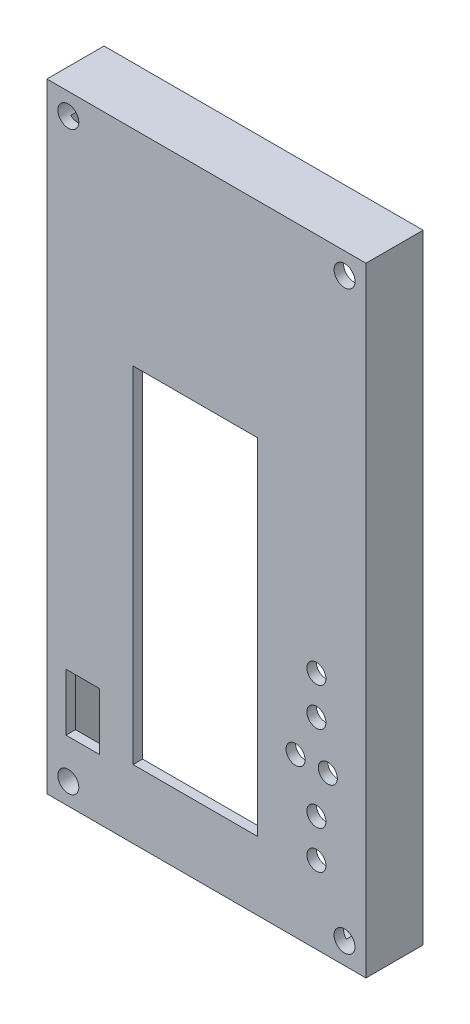
ISO-10303-21;
HEADER;
FILE_DESCRIPTION(('STEP AP214'),'2;1');
FILE_NAME('part.step','',(''),(''),'','','');
FILE_SCHEMA(('AUTOMOTIVE_DESIGN { 1 0 10303 214 1 1 1 1 }'));
ENDSEC;
DATA;
#1=APPLICATION_CONTEXT('core data for automotive mechanical design processes');
#2=APPLICATION_PROTOCOL_DEFINITION('international standard','automotive_design',2000,#1);
#3=PRODUCT_CONTEXT('',#1,'mechanical');
#4=PRODUCT('Part','Part','',(#3));
#5=PRODUCT_RELATED_PRODUCT_CATEGORY('part','',(#4));
#6=PRODUCT_DEFINITION_FORMATION('','',#4);
#7=PRODUCT_DEFINITION_CONTEXT('part definition',#1,'design');
#8=PRODUCT_DEFINITION('design','',#6,#7);
#9=PRODUCT_DEFINITION_SHAPE('','',#8);
#10=(LENGTH_UNIT() NAMED_UNIT(*) SI_UNIT(.MILLI.,.METRE.));
#11=(NAMED_UNIT(*) PLANE_ANGLE_UNIT() SI_UNIT($,.RADIAN.));
#12=(NAMED_UNIT(*) SI_UNIT($,.STERADIAN.) SOLID_ANGLE_UNIT());
#13=UNCERTAINTY_MEASURE_WITH_UNIT(LENGTH_MEASURE(1.E-05),#10,'distance_accuracy_value','');
#14=(GEOMETRIC_REPRESENTATION_CONTEXT(3) GLOBAL_UNCERTAINTY_ASSIGNED_CONTEXT((#13)) GLOBAL_UNIT_ASSIGNED_CONTEXT((#10,
#11,#12)) REPRESENTATION_CONTEXT('',''));
#15=CARTESIAN_POINT('',(0.,0.,0.));
#16=DIRECTION('',(0.,0.,1.));
#17=DIRECTION('',(1.,0.,0.));
#18=AXIS2_PLACEMENT_3D('',#15,#16,#17);
#19=CARTESIAN_POINT('',(0.,0.,0.));
#20=DIRECTION('',(0.,0.,-1.));
#21=DIRECTION('',(-1.,0.,0.));
#22=AXIS2_PLACEMENT_3D('',#19,#20,#21);
#23=PLANE('',#22);
#24=CARTESIAN_POINT('',(29.0000000000004,57.1675022635253,0.));
#25=DIRECTION('',(0.,0.,1.));
#26=DIRECTION('',(1.,0.,0.));
#27=AXIS2_PLACEMENT_3D('',#24,#25,#26);
#28=CIRCLE('',#27,2.2);
#29=CARTESIAN_POINT('',(30.5000000000004,55.5581545695822,0.));
#30=VERTEX_POINT('',#29);
#31=CARTESIAN_POINT('',(27.3906523060562,58.6675022635241,0.));
#32=VERTEX_POINT('',#31);
#33=EDGE_CURVE('E205',#30,#32,#28,.T.);
#34=ORIENTED_EDGE('',*,*,#33,.T.);
#35=DIRECTION('',(-1.,0.,0.));
#36=VECTOR('',#35,1.);
#37=CARTESIAN_POINT('',(-30.5000000000004,58.6675022635241,0.));
#38=LINE('',#37,#36);
#39=CARTESIAN_POINT('',(-27.390652306057,58.6675022635241,0.));
#40=VERTEX_POINT('',#39);
#41=EDGE_CURVE('E197',#32,#40,#38,.T.);
#42=ORIENTED_EDGE('',*,*,#41,.T.);
#43=CARTESIAN_POINT('',(-29.0000000000006,57.1675022635246,0.));
#44=DIRECTION('',(0.,0.,1.));
#45=DIRECTION('',(1.,0.,0.));
#46=AXIS2_PLACEMENT_3D('',#43,#44,#45);
#47=CIRCLE('',#46,2.2);
#48=CARTESIAN_POINT('',(-30.5000000000004,55.5581545695813,0.));
#49=VERTEX_POINT('',#48);
#50=EDGE_CURVE('E176',#40,#49,#47,.T.);
#51=ORIENTED_EDGE('',*,*,#50,.T.);
#52=DIRECTION('',(0.,-1.,0.));
#53=VECTOR('',#52,1.);
#54=CARTESIAN_POINT('',(-30.5000000000004,-65.3324977364759,0.));
#55=LINE('',#54,#53);
#56=CARTESIAN_POINT('',(-30.5000000000004,-62.2231500425326,0.));
#57=VERTEX_POINT('',#56);
#58=EDGE_CURVE('E277',#49,#57,#55,.T.);
#59=ORIENTED_EDGE('',*,*,#58,.T.);
#60=CARTESIAN_POINT('',(-29.0000000000006,-63.8324977364759,0.));
#61=DIRECTION('',(0.,0.,1.));
#62=DIRECTION('',(1.,0.,0.));
#63=AXIS2_PLACEMENT_3D('',#60,#61,#62);
#64=CIRCLE('',#63,2.2);
#65=CARTESIAN_POINT('',(-27.3906523060574,-65.3324977364759,0.));
#66=VERTEX_POINT('',#65);
#67=EDGE_CURVE('E296',#57,#66,#64,.T.);
#68=ORIENTED_EDGE('',*,*,#67,.T.);
#69=DIRECTION('',(1.,0.,0.));
#70=VECTOR('',#69,1.);
#71=CARTESIAN_POINT('',(-30.5000000000004,-65.3324977364759,0.));
#72=LINE('',#71,#70);
#73=CARTESIAN_POINT('',(27.3906523060573,-65.3324977364759,0.));
#74=VERTEX_POINT('',#73);
#75=EDGE_CURVE('E215',#66,#74,#72,.T.);
#76=ORIENTED_EDGE('',*,*,#75,.T.);
#77=CARTESIAN_POINT('',(29.0000000000004,-63.8324977364759,0.));
#78=DIRECTION('',(0.,0.,1.));
#79=DIRECTION('',(1.,0.,0.));
#80=AXIS2_PLACEMENT_3D('',#77,#78,#79);
#81=CIRCLE('',#80,2.2);
#82=CARTESIAN_POINT('',(30.5000000000004,-62.2231500425328,0.));
#83=VERTEX_POINT('',#82);
#84=EDGE_CURVE('E294',#74,#83,#81,.T.);
#85=ORIENTED_EDGE('',*,*,#84,.T.);
#86=DIRECTION('',(0.,1.,0.));
#87=VECTOR('',#86,1.);
#88=CARTESIAN_POINT('',(30.5000000000004,-65.3324977364759,0.));
#89=LINE('',#88,#87);
#90=EDGE_CURVE('E208',#83,#30,#89,.T.);
#91=ORIENTED_EDGE('',*,*,#90,.T.);
#92=EDGE_LOOP('',(#34,#42,#51,#59,#68,#76,#85,#91));
#93=FACE_BOUND('',#92,.T.);
#94=DIRECTION('',(0.,-1.,0.));
#95=VECTOR('',#94,1.);
#96=CARTESIAN_POINT('',(-33.5000000000004,-68.3324977364759,0.));
#97=LINE('',#96,#95);
#98=CARTESIAN_POINT('',(-33.5000000000004,61.6675022635241,0.));
#99=VERTEX_POINT('',#98);
#100=CARTESIAN_POINT('',(-33.5000000000004,-68.3324977364759,0.));
#101=VERTEX_POINT('',#100);
#102=EDGE_CURVE('E219',#99,#101,#97,.T.);
#103=ORIENTED_EDGE('',*,*,#102,.F.);
#104=DIRECTION('',(-1.,0.,0.));
#105=VECTOR('',#104,1.);
#106=CARTESIAN_POINT('',(-33.5000000000004,61.6675022635241,0.));
#107=LINE('',#106,#105);
#108=CARTESIAN_POINT('',(33.5000000000004,61.6675022635241,0.));
#109=VERTEX_POINT('',#108);
#110=EDGE_CURVE('E229',#109,#99,#107,.T.);
#111=ORIENTED_EDGE('',*,*,#110,.F.);
#112=DIRECTION('',(0.,1.,0.));
#113=VECTOR('',#112,1.);
#114=CARTESIAN_POINT('',(33.5000000000004,-68.3324977364759,0.));
#115=LINE('',#114,#113);
#116=CARTESIAN_POINT('',(33.5000000000004,-68.3324977364759,0.));
#117=VERTEX_POINT('',#116);
#118=EDGE_CURVE('E226',#117,#109,#115,.T.);
#119=ORIENTED_EDGE('',*,*,#118,.F.);
#120=DIRECTION('',(1.,0.,0.));
#121=VECTOR('',#120,1.);
#122=CARTESIAN_POINT('',(-33.5000000000004,-68.3324977364759,0.));
#123=LINE('',#122,#121);
#124=EDGE_CURVE('E223',#101,#117,#123,.T.);
#125=ORIENTED_EDGE('',*,*,#124,.F.);
#126=EDGE_LOOP('',(#103,#111,#119,#125));
#127=FACE_BOUND('',#126,.T.);
#128=ADVANCED_FACE('F39',(#93,#127),#23,.T.);
#129=CARTESIAN_POINT('',(-33.5000000000004,-68.3324977364759,10.));
#130=DIRECTION('',(1.,0.,0.));
#131=DIRECTION('',(0.,0.,-1.));
#132=AXIS2_PLACEMENT_3D('',#129,#130,#131);
#133=PLANE('',#132);
#134=ORIENTED_EDGE('',*,*,#102,.T.);
#135=DIRECTION('',(0.,0.,-1.));
#136=VECTOR('',#135,1.);
#137=CARTESIAN_POINT('',(-33.5000000000004,-68.3324977364759,10.));
#138=LINE('',#137,#136);
#139=CARTESIAN_POINT('',(-33.5000000000004,-68.3324977364759,12.));
#140=VERTEX_POINT('',#139);
#141=EDGE_CURVE('E11',#140,#101,#138,.T.);
#142=ORIENTED_EDGE('',*,*,#141,.F.);
#143=DIRECTION('',(0.,-1.,0.));
#144=VECTOR('',#143,1.);
#145=CARTESIAN_POINT('',(-33.5000000000004,-68.3324977364759,12.));
#146=LINE('',#145,#144);
#147=CARTESIAN_POINT('',(-33.5000000000004,61.6675022635241,12.));
#148=VERTEX_POINT('',#147);
#149=EDGE_CURVE('E259',#148,#140,#146,.T.);
#150=ORIENTED_EDGE('',*,*,#149,.F.);
#151=DIRECTION('',(0.,0.,-1.));
#152=VECTOR('',#151,1.);
#153=CARTESIAN_POINT('',(-33.5000000000004,61.6675022635241,10.));
#154=LINE('',#153,#152);
#155=EDGE_CURVE('E232',#148,#99,#154,.T.);
#156=ORIENTED_EDGE('',*,*,#155,.T.);
#157=EDGE_LOOP('',(#134,#142,#150,#156));
#158=FACE_BOUND('',#157,.T.);
#159=ADVANCED_FACE('F41',(#158),#133,.F.);
#160=CARTESIAN_POINT('',(-33.5000000000004,-68.3324977364759,10.));
#161=DIRECTION('',(0.,1.,0.));
#162=DIRECTION('',(0.,0.,1.));
#163=AXIS2_PLACEMENT_3D('',#160,#161,#162);
#164=PLANE('',#163);
#165=ORIENTED_EDGE('',*,*,#124,.T.);
#166=DIRECTION('',(0.,0.,-1.));
#167=VECTOR('',#166,1.);
#168=CARTESIAN_POINT('',(33.5000000000004,-68.3324977364759,10.));
#169=LINE('',#168,#167);
#170=CARTESIAN_POINT('',(33.5000000000004,-68.3324977364759,12.));
#171=VERTEX_POINT('',#170);
#172=EDGE_CURVE('E48',#171,#117,#169,.T.);
#173=ORIENTED_EDGE('',*,*,#172,.F.);
#174=DIRECTION('',(1.,0.,0.));
#175=VECTOR('',#174,1.);
#176=CARTESIAN_POINT('',(-33.5000000000004,-68.3324977364759,12.));
#177=LINE('',#176,#175);
#178=EDGE_CURVE('E262',#140,#171,#177,.T.);
#179=ORIENTED_EDGE('',*,*,#178,.F.);
#180=ORIENTED_EDGE('',*,*,#141,.T.);
#181=EDGE_LOOP('',(#165,#173,#179,#180));
#182=FACE_BOUND('',#181,.T.);
#183=ADVANCED_FACE('F510',(#182),#164,.F.);
#184=CARTESIAN_POINT('',(33.5000000000004,-68.3324977364759,10.));
#185=DIRECTION('',(-1.,0.,0.));
#186=DIRECTION('',(0.,0.,1.));
#187=AXIS2_PLACEMENT_3D('',#184,#185,#186);
#188=PLANE('',#187);
#189=ORIENTED_EDGE('',*,*,#118,.T.);
#190=DIRECTION('',(0.,0.,-1.));
#191=VECTOR('',#190,1.);
#192=CARTESIAN_POINT('',(33.5000000000004,61.6675022635241,10.));
#193=LINE('',#192,#191);
#194=CARTESIAN_POINT('',(33.5000000000004,61.6675022635241,12.));
#195=VERTEX_POINT('',#194);
#196=EDGE_CURVE('E236',#195,#109,#193,.T.);
#197=ORIENTED_EDGE('',*,*,#196,.F.);
#198=DIRECTION('',(0.,1.,0.));
#199=VECTOR('',#198,1.);
#200=CARTESIAN_POINT('',(33.5000000000004,-68.3324977364759,12.));
#201=LINE('',#200,#199);
#202=EDGE_CURVE('E246',#171,#195,#201,.T.);
#203=ORIENTED_EDGE('',*,*,#202,.F.);
#204=ORIENTED_EDGE('',*,*,#172,.T.);
#205=EDGE_LOOP('',(#189,#197,#203,#204));
#206=FACE_BOUND('',#205,.T.);
#207=ADVANCED_FACE('F244',(#206),#188,.F.);
#208=CARTESIAN_POINT('',(-33.5000000000004,61.6675022635241,10.));
#209=DIRECTION('',(0.,-1.,0.));
#210=DIRECTION('',(0.,0.,-1.));
#211=AXIS2_PLACEMENT_3D('',#208,#209,#210);
#212=PLANE('',#211);
#213=ORIENTED_EDGE('',*,*,#110,.T.);
#214=ORIENTED_EDGE('',*,*,#155,.F.);
#215=DIRECTION('',(-1.,0.,0.));
#216=VECTOR('',#215,1.);
#217=CARTESIAN_POINT('',(-33.5000000000004,61.6675022635241,12.));
#218=LINE('',#217,#216);
#219=EDGE_CURVE('E275',#195,#148,#218,.T.);
#220=ORIENTED_EDGE('',*,*,#219,.F.);
#221=ORIENTED_EDGE('',*,*,#196,.T.);
#222=EDGE_LOOP('',(#213,#214,#220,#221));
#223=FACE_BOUND('',#222,.T.);
#224=ADVANCED_FACE('F253',(#223),#212,.F.);
#225=CARTESIAN_POINT('',(-30.5000000000004,-65.3324977364759,10.));
#226=DIRECTION('',(1.,0.,0.));
#227=DIRECTION('',(0.,0.,-1.));
#228=AXIS2_PLACEMENT_3D('',#225,#226,#227);
#229=PLANE('',#228);
#230=DIRECTION('',(0.,0.,1.));
#231=VECTOR('',#230,1.);
#232=CARTESIAN_POINT('',(-30.5000000000004,-62.2231500425326,0.));
#233=LINE('',#232,#231);
#234=CARTESIAN_POINT('',(-30.5000000000004,-62.2231500425326,10.));
#235=VERTEX_POINT('',#234);
#236=EDGE_CURVE('E315',#57,#235,#233,.T.);
#237=ORIENTED_EDGE('',*,*,#236,.F.);
#238=ORIENTED_EDGE('',*,*,#58,.F.);
#239=DIRECTION('',(0.,0.,1.));
#240=VECTOR('',#239,1.);
#241=CARTESIAN_POINT('',(-30.5000000000004,55.5581545695813,0.));
#242=LINE('',#241,#240);
#243=CARTESIAN_POINT('',(-30.5000000000004,55.5581545695813,10.));
#244=VERTEX_POINT('',#243);
#245=EDGE_CURVE('E183',#244,#49,#242,.F.);
#246=ORIENTED_EDGE('',*,*,#245,.F.);
#247=DIRECTION('',(0.,-1.,0.));
#248=VECTOR('',#247,1.);
#249=CARTESIAN_POINT('',(-30.5000000000004,-65.3324977364759,10.));
#250=LINE('',#249,#248);
#251=EDGE_CURVE('E207',#244,#235,#250,.T.);
#252=ORIENTED_EDGE('',*,*,#251,.T.);
#253=EDGE_LOOP('',(#237,#238,#246,#252));
#254=FACE_BOUND('',#253,.T.);
#255=ADVANCED_FACE('F513',(#254),#229,.T.);
#256=CARTESIAN_POINT('',(-30.5000000000004,-65.3324977364759,10.));
#257=DIRECTION('',(0.,1.,0.));
#258=DIRECTION('',(0.,0.,1.));
#259=AXIS2_PLACEMENT_3D('',#256,#257,#258);
#260=PLANE('',#259);
#261=DIRECTION('',(0.,0.,1.));
#262=VECTOR('',#261,1.);
#263=CARTESIAN_POINT('',(-27.3906523060574,-65.3324977364759,0.));
#264=LINE('',#263,#262);
#265=CARTESIAN_POINT('',(-27.3906523060574,-65.3324977364759,10.));
#266=VERTEX_POINT('',#265);
#267=EDGE_CURVE('E300',#266,#66,#264,.F.);
#268=ORIENTED_EDGE('',*,*,#267,.F.);
#269=DIRECTION('',(1.,0.,0.));
#270=VECTOR('',#269,1.);
#271=CARTESIAN_POINT('',(-30.5000000000004,-65.3324977364759,10.));
#272=LINE('',#271,#270);
#273=CARTESIAN_POINT('',(27.3906523060573,-65.3324977364759,10.));
#274=VERTEX_POINT('',#273);
#275=EDGE_CURVE('E213',#266,#274,#272,.T.);
#276=ORIENTED_EDGE('',*,*,#275,.T.);
#277=DIRECTION('',(0.,0.,1.));
#278=VECTOR('',#277,1.);
#279=CARTESIAN_POINT('',(27.3906523060573,-65.3324977364759,0.));
#280=LINE('',#279,#278);
#281=EDGE_CURVE('E55',#74,#274,#280,.T.);
#282=ORIENTED_EDGE('',*,*,#281,.F.);
#283=ORIENTED_EDGE('',*,*,#75,.F.);
#284=EDGE_LOOP('',(#268,#276,#282,#283));
#285=FACE_BOUND('',#284,.T.);
#286=ADVANCED_FACE('F299',(#285),#260,.T.);
#287=CARTESIAN_POINT('',(30.5000000000004,-65.3324977364759,10.));
#288=DIRECTION('',(-1.,0.,0.));
#289=DIRECTION('',(0.,-1.,0.));
#290=AXIS2_PLACEMENT_3D('',#287,#288,#289);
#291=PLANE('',#290);
#292=DIRECTION('',(0.,0.,1.));
#293=VECTOR('',#292,1.);
#294=CARTESIAN_POINT('',(30.5000000000004,55.5581545695822,0.));
#295=LINE('',#294,#293);
#296=CARTESIAN_POINT('',(30.5000000000004,55.5581545695822,10.));
#297=VERTEX_POINT('',#296);
#298=EDGE_CURVE('E63',#30,#297,#295,.T.);
#299=ORIENTED_EDGE('',*,*,#298,.F.);
#300=ORIENTED_EDGE('',*,*,#90,.F.);
#301=DIRECTION('',(0.,0.,1.));
#302=VECTOR('',#301,1.);
#303=CARTESIAN_POINT('',(30.5000000000004,-62.2231500425328,0.));
#304=LINE('',#303,#302);
#305=CARTESIAN_POINT('',(30.5000000000004,-62.2231500425328,10.));
#306=VERTEX_POINT('',#305);
#307=EDGE_CURVE('E304',#306,#83,#304,.F.);
#308=ORIENTED_EDGE('',*,*,#307,.F.);
#309=DIRECTION('',(0.,1.,0.));
#310=VECTOR('',#309,1.);
#311=CARTESIAN_POINT('',(30.5000000000004,-65.3324977364759,10.));
#312=LINE('',#311,#310);
#313=EDGE_CURVE('E282',#306,#297,#312,.T.);
#314=ORIENTED_EDGE('',*,*,#313,.T.);
#315=EDGE_LOOP('',(#299,#300,#308,#314));
#316=FACE_BOUND('',#315,.T.);
#317=ADVANCED_FACE('F544',(#316),#291,.T.);
#318=CARTESIAN_POINT('',(-30.5000000000004,58.6675022635241,10.));
#319=DIRECTION('',(0.,-1.,0.));
#320=DIRECTION('',(0.,0.,-1.));
#321=AXIS2_PLACEMENT_3D('',#318,#319,#320);
#322=PLANE('',#321);
#323=DIRECTION('',(0.,0.,1.));
#324=VECTOR('',#323,1.);
#325=CARTESIAN_POINT('',(27.3906523060562,58.6675022635241,0.));
#326=LINE('',#325,#324);
#327=CARTESIAN_POINT('',(27.3906523060562,58.6675022635241,10.));
#328=VERTEX_POINT('',#327);
#329=EDGE_CURVE('E321',#328,#32,#326,.F.);
#330=ORIENTED_EDGE('',*,*,#329,.F.);
#331=DIRECTION('',(-1.,0.,0.));
#332=VECTOR('',#331,1.);
#333=CARTESIAN_POINT('',(-30.5000000000004,58.6675022635241,10.));
#334=LINE('',#333,#332);
#335=CARTESIAN_POINT('',(-27.390652306057,58.6675022635241,10.));
#336=VERTEX_POINT('',#335);
#337=EDGE_CURVE('E199',#328,#336,#334,.T.);
#338=ORIENTED_EDGE('',*,*,#337,.T.);
#339=DIRECTION('',(0.,0.,1.));
#340=VECTOR('',#339,1.);
#341=CARTESIAN_POINT('',(-27.390652306057,58.6675022635241,0.));
#342=LINE('',#341,#340);
#343=EDGE_CURVE('E180',#40,#336,#342,.T.);
#344=ORIENTED_EDGE('',*,*,#343,.F.);
#345=ORIENTED_EDGE('',*,*,#41,.F.);
#346=EDGE_LOOP('',(#330,#338,#344,#345));
#347=FACE_BOUND('',#346,.T.);
#348=ADVANCED_FACE('F196',(#347),#322,.T.);
#349=CARTESIAN_POINT('',(0.,0.,10.));
#350=DIRECTION('',(0.,0.,-1.));
#351=DIRECTION('',(-1.,0.,0.));
#352=AXIS2_PLACEMENT_3D('',#349,#350,#351);
#353=PLANE('',#352);
#354=CARTESIAN_POINT('',(29.0000000000004,57.1675022635253,10.));
#355=DIRECTION('',(0.,0.,-1.));
#356=DIRECTION('',(-1.,0.,0.));
#357=AXIS2_PLACEMENT_3D('',#354,#355,#356);
#358=CIRCLE('',#357,2.2);
#359=EDGE_CURVE('E318',#297,#328,#358,.T.);
#360=ORIENTED_EDGE('',*,*,#359,.F.);
#361=ORIENTED_EDGE('',*,*,#313,.F.);
#362=CARTESIAN_POINT('',(29.0000000000004,-63.8324977364759,10.));
#363=DIRECTION('',(0.,0.,-1.));
#364=DIRECTION('',(-1.,0.,0.));
#365=AXIS2_PLACEMENT_3D('',#362,#363,#364);
#366=CIRCLE('',#365,2.2);
#367=EDGE_CURVE('E309',#274,#306,#366,.T.);
#368=ORIENTED_EDGE('',*,*,#367,.F.);
#369=ORIENTED_EDGE('',*,*,#275,.F.);
#370=CARTESIAN_POINT('',(-29.0000000000006,-63.8324977364759,10.));
#371=DIRECTION('',(0.,0.,-1.));
#372=DIRECTION('',(-1.,0.,0.));
#373=AXIS2_PLACEMENT_3D('',#370,#371,#372);
#374=CIRCLE('',#373,2.2);
#375=EDGE_CURVE('E303',#235,#266,#374,.T.);
#376=ORIENTED_EDGE('',*,*,#375,.F.);
#377=ORIENTED_EDGE('',*,*,#251,.F.);
#378=CARTESIAN_POINT('',(-29.0000000000006,57.1675022635246,10.));
#379=DIRECTION('',(0.,0.,-1.));
#380=DIRECTION('',(-1.,0.,0.));
#381=AXIS2_PLACEMENT_3D('',#378,#379,#380);
#382=CIRCLE('',#381,2.2);
#383=EDGE_CURVE('E189',#336,#244,#382,.T.);
#384=ORIENTED_EDGE('',*,*,#383,.F.);
#385=ORIENTED_EDGE('',*,*,#337,.F.);
#386=EDGE_LOOP('',(#360,#361,#368,#369,#376,#377,#384,#385));
#387=FACE_BOUND('',#386,.T.);
#388=CARTESIAN_POINT('',(23.0964500000001,-52.1195522635235,10.));
#389=DIRECTION('',(0.,0.,-1.));
#390=DIRECTION('',(-1.,0.,0.));
#391=AXIS2_PLACEMENT_3D('',#388,#389,#390);
#392=CIRCLE('',#391,2.);
#393=CARTESIAN_POINT('',(21.0964500000001,-52.1195522635235,10.));
#394=VERTEX_POINT('',#393);
#395=EDGE_CURVE('E370',#394,#394,#392,.T.);
#396=ORIENTED_EDGE('',*,*,#395,.F.);
#397=EDGE_LOOP('',(#396));
#398=FACE_BOUND('',#397,.T.);
#399=CARTESIAN_POINT('',(23.0964499999998,-26.1154522635235,10.));
#400=DIRECTION('',(0.,0.,-1.));
#401=DIRECTION('',(-1.,0.,0.));
#402=AXIS2_PLACEMENT_3D('',#399,#400,#401);
#403=CIRCLE('',#402,2.);
#404=CARTESIAN_POINT('',(21.0964499999998,-26.1154522635235,10.));
#405=VERTEX_POINT('',#404);
#406=EDGE_CURVE('E366',#405,#405,#403,.T.);
#407=ORIENTED_EDGE('',*,*,#406,.F.);
#408=EDGE_LOOP('',(#407));
#409=FACE_BOUND('',#408,.T.);
#410=CARTESIAN_POINT('',(18.7156472457008,-35.0638056060374,10.));
#411=DIRECTION('',(0.,0.,-1.));
#412=DIRECTION('',(-1.,0.,0.));
#413=AXIS2_PLACEMENT_3D('',#410,#411,#412);
#414=CIRCLE('',#413,2.);
#415=CARTESIAN_POINT('',(16.7156472457008,-35.0638056060374,10.));
#416=VERTEX_POINT('',#415);
#417=EDGE_CURVE('E362',#416,#416,#414,.T.);
#418=ORIENTED_EDGE('',*,*,#417,.F.);
#419=EDGE_LOOP('',(#418));
#420=FACE_BOUND('',#419,.T.);
#421=CARTESIAN_POINT('',(25.4964635542668,-35.0661063612734,10.));
#422=DIRECTION('',(0.,0.,-1.));
#423=DIRECTION('',(-1.,0.,0.));
#424=AXIS2_PLACEMENT_3D('',#421,#422,#423);
#425=CIRCLE('',#424,2.);
#426=CARTESIAN_POINT('',(23.4964635542668,-35.0661063612734,10.));
#427=VERTEX_POINT('',#426);
#428=EDGE_CURVE('E358',#427,#427,#425,.T.);
#429=ORIENTED_EDGE('',*,*,#428,.F.);
#430=EDGE_LOOP('',(#429));
#431=FACE_BOUND('',#430,.T.);
#432=CARTESIAN_POINT('',(23.09645,-44.1154522635235,10.));
#433=DIRECTION('',(0.,0.,-1.));
#434=DIRECTION('',(-1.,0.,0.));
#435=AXIS2_PLACEMENT_3D('',#432,#433,#434);
#436=CIRCLE('',#435,2.);
#437=CARTESIAN_POINT('',(21.09645,-44.1154522635235,10.));
#438=VERTEX_POINT('',#437);
#439=EDGE_CURVE('E354',#438,#438,#436,.T.);
#440=ORIENTED_EDGE('',*,*,#439,.F.);
#441=EDGE_LOOP('',(#440));
#442=FACE_BOUND('',#441,.T.);
#443=CARTESIAN_POINT('',(23.0964499999997,-18.1154522635235,10.));
#444=DIRECTION('',(0.,0.,-1.));
#445=DIRECTION('',(-1.,0.,0.));
#446=AXIS2_PLACEMENT_3D('',#443,#444,#445);
#447=CIRCLE('',#446,2.);
#448=CARTESIAN_POINT('',(21.0964499999997,-18.1154522635235,10.));
#449=VERTEX_POINT('',#448);
#450=EDGE_CURVE('E331',#449,#449,#447,.T.);
#451=ORIENTED_EDGE('',*,*,#450,.F.);
#452=EDGE_LOOP('',(#451));
#453=FACE_BOUND('',#452,.T.);
#454=DIRECTION('',(-1.,0.,0.));
#455=VECTOR('',#454,1.);
#456=CARTESIAN_POINT('',(-29.5000000000004,-43.6675022664759,10.));
#457=LINE('',#456,#455);
#458=CARTESIAN_POINT('',(-22.5000000000004,-43.6675022664759,10.));
#459=VERTEX_POINT('',#458);
#460=CARTESIAN_POINT('',(-29.5000000000004,-43.6675022664759,10.));
#461=VERTEX_POINT('',#460);
#462=EDGE_CURVE('E379',#459,#461,#457,.T.);
#463=ORIENTED_EDGE('',*,*,#462,.T.);
#464=DIRECTION('',(0.,-1.,0.));
#465=VECTOR('',#464,1.);
#466=CARTESIAN_POINT('',(-29.5000000000004,-55.6675022635241,10.));
#467=LINE('',#466,#465);
#468=CARTESIAN_POINT('',(-29.5000000000004,-55.6675022635241,10.));
#469=VERTEX_POINT('',#468);
#470=EDGE_CURVE('E374',#461,#469,#467,.T.);
#471=ORIENTED_EDGE('',*,*,#470,.T.);
#472=DIRECTION('',(1.,0.,0.));
#473=VECTOR('',#472,1.);
#474=CARTESIAN_POINT('',(-29.5000000000004,-55.6675022635241,10.));
#475=LINE('',#474,#473);
#476=CARTESIAN_POINT('',(-22.5000000000004,-55.6675022635241,10.));
#477=VERTEX_POINT('',#476);
#478=EDGE_CURVE('E393',#469,#477,#475,.T.);
#479=ORIENTED_EDGE('',*,*,#478,.T.);
#480=DIRECTION('',(0.,1.,0.));
#481=VECTOR('',#480,1.);
#482=CARTESIAN_POINT('',(-22.5000000000004,-55.6675022635241,10.));
#483=LINE('',#482,#481);
#484=EDGE_CURVE('E397',#477,#459,#483,.T.);
#485=ORIENTED_EDGE('',*,*,#484,.T.);
#486=EDGE_LOOP('',(#463,#471,#479,#485));
#487=FACE_BOUND('',#486,.T.);
#488=DIRECTION('',(-1.,0.,0.));
#489=VECTOR('',#488,1.);
#490=CARTESIAN_POINT('',(-15.4000000000004,18.5324977364759,10.));
#491=LINE('',#490,#489);
#492=CARTESIAN_POINT('',(10.6999999999996,18.5324977364759,10.));
#493=VERTEX_POINT('',#492);
#494=CARTESIAN_POINT('',(-15.4000000000004,18.5324977364759,10.));
#495=VERTEX_POINT('',#494);
#496=EDGE_CURVE('E422',#493,#495,#491,.T.);
#497=ORIENTED_EDGE('',*,*,#496,.T.);
#498=DIRECTION('',(0.,-1.,0.));
#499=VECTOR('',#498,1.);
#500=CARTESIAN_POINT('',(-15.4000000000004,-53.9675022635241,10.));
#501=LINE('',#500,#499);
#502=CARTESIAN_POINT('',(-15.4000000000004,-53.9675022635241,10.));
#503=VERTEX_POINT('',#502);
#504=EDGE_CURVE('E417',#495,#503,#501,.T.);
#505=ORIENTED_EDGE('',*,*,#504,.T.);
#506=DIRECTION('',(1.,0.,0.));
#507=VECTOR('',#506,1.);
#508=CARTESIAN_POINT('',(-15.4000000000004,-53.9675022635241,10.));
#509=LINE('',#508,#507);
#510=CARTESIAN_POINT('',(10.6999999999996,-53.9675022635241,10.));
#511=VERTEX_POINT('',#510);
#512=EDGE_CURVE('E436',#503,#511,#509,.T.);
#513=ORIENTED_EDGE('',*,*,#512,.T.);
#514=DIRECTION('',(0.,1.,0.));
#515=VECTOR('',#514,1.);
#516=CARTESIAN_POINT('',(10.6999999999996,-53.9675022635241,10.));
#517=LINE('',#516,#515);
#518=EDGE_CURVE('E440',#511,#493,#517,.T.);
#519=ORIENTED_EDGE('',*,*,#518,.T.);
#520=EDGE_LOOP('',(#497,#505,#513,#519));
#521=FACE_BOUND('',#520,.T.);
#522=ADVANCED_FACE('F464',(#387,#398,#409,#420,#431,#442,#453,#487,#521),#353,.T.);
#523=CARTESIAN_POINT('',(0.,0.,12.));
#524=DIRECTION('',(0.,0.,-1.));
#525=DIRECTION('',(-1.,0.,0.));
#526=AXIS2_PLACEMENT_3D('',#523,#524,#525);
#527=PLANE('',#526);
#528=CARTESIAN_POINT('',(29.0000000000004,57.1675022635253,12.));
#529=DIRECTION('',(0.,0.,1.));
#530=DIRECTION('',(1.,0.,0.));
#531=AXIS2_PLACEMENT_3D('',#528,#529,#530);
#532=CIRCLE('',#531,2.2);
#533=CARTESIAN_POINT('',(31.2000000000004,57.1675022635253,12.));
#534=VERTEX_POINT('',#533);
#535=EDGE_CURVE('E761',#534,#534,#532,.T.);
#536=ORIENTED_EDGE('',*,*,#535,.F.);
#537=EDGE_LOOP('',(#536));
#538=FACE_BOUND('',#537,.T.);
#539=CARTESIAN_POINT('',(-29.0000000000006,-63.8324977364759,12.));
#540=DIRECTION('',(0.,0.,1.));
#541=DIRECTION('',(1.,0.,0.));
#542=AXIS2_PLACEMENT_3D('',#539,#540,#541);
#543=CIRCLE('',#542,2.2);
#544=CARTESIAN_POINT('',(-26.8000000000005,-63.8324977364759,12.));
#545=VERTEX_POINT('',#544);
#546=EDGE_CURVE('E767',#545,#545,#543,.T.);
#547=ORIENTED_EDGE('',*,*,#546,.F.);
#548=EDGE_LOOP('',(#547));
#549=FACE_BOUND('',#548,.T.);
#550=CARTESIAN_POINT('',(29.0000000000004,-63.8324977364759,12.));
#551=DIRECTION('',(0.,0.,1.));
#552=DIRECTION('',(1.,0.,0.));
#553=AXIS2_PLACEMENT_3D('',#550,#551,#552);
#554=CIRCLE('',#553,2.2);
#555=CARTESIAN_POINT('',(31.2000000000004,-63.8324977364759,12.));
#556=VERTEX_POINT('',#555);
#557=EDGE_CURVE('E795',#556,#556,#554,.T.);
#558=ORIENTED_EDGE('',*,*,#557,.F.);
#559=EDGE_LOOP('',(#558));
#560=FACE_BOUND('',#559,.T.);
#561=CARTESIAN_POINT('',(-29.0000000000006,57.1675022635246,12.));
#562=DIRECTION('',(0.,0.,1.));
#563=DIRECTION('',(1.,0.,0.));
#564=AXIS2_PLACEMENT_3D('',#561,#562,#563);
#565=CIRCLE('',#564,2.2);
#566=CARTESIAN_POINT('',(-26.8000000000005,57.1675022635246,12.));
#567=VERTEX_POINT('',#566);
#568=EDGE_CURVE('E190',#567,#567,#565,.T.);
#569=ORIENTED_EDGE('',*,*,#568,.F.);
#570=EDGE_LOOP('',(#569));
#571=FACE_BOUND('',#570,.T.);
#572=CARTESIAN_POINT('',(23.0964500000001,-52.1195522635235,12.));
#573=DIRECTION('',(0.,0.,1.));
#574=DIRECTION('',(1.,0.,0.));
#575=AXIS2_PLACEMENT_3D('',#572,#573,#574);
#576=CIRCLE('',#575,2.);
#577=CARTESIAN_POINT('',(25.0964500000001,-52.1195522635235,12.));
#578=VERTEX_POINT('',#577);
#579=EDGE_CURVE('E327',#578,#578,#576,.T.);
#580=ORIENTED_EDGE('',*,*,#579,.F.);
#581=EDGE_LOOP('',(#580));
#582=FACE_BOUND('',#581,.T.);
#583=CARTESIAN_POINT('',(23.0964499999998,-26.1154522635235,12.));
#584=DIRECTION('',(0.,0.,1.));
#585=DIRECTION('',(1.,0.,0.));
#586=AXIS2_PLACEMENT_3D('',#583,#584,#585);
#587=CIRCLE('',#586,2.);
#588=CARTESIAN_POINT('',(25.0964499999998,-26.1154522635235,12.));
#589=VERTEX_POINT('',#588);
#590=EDGE_CURVE('E338',#589,#589,#587,.T.);
#591=ORIENTED_EDGE('',*,*,#590,.F.);
#592=EDGE_LOOP('',(#591));
#593=FACE_BOUND('',#592,.T.);
#594=CARTESIAN_POINT('',(18.7156472457008,-35.0638056060374,12.));
#595=DIRECTION('',(0.,0.,1.));
#596=DIRECTION('',(1.,0.,0.));
#597=AXIS2_PLACEMENT_3D('',#594,#595,#596);
#598=CIRCLE('',#597,2.);
#599=CARTESIAN_POINT('',(20.7156472457008,-35.0638056060374,12.));
#600=VERTEX_POINT('',#599);
#601=EDGE_CURVE('E333',#600,#600,#598,.T.);
#602=ORIENTED_EDGE('',*,*,#601,.F.);
#603=EDGE_LOOP('',(#602));
#604=FACE_BOUND('',#603,.T.);
#605=CARTESIAN_POINT('',(25.4964635542668,-35.0661063612734,12.));
#606=DIRECTION('',(0.,0.,1.));
#607=DIRECTION('',(1.,0.,0.));
#608=AXIS2_PLACEMENT_3D('',#605,#606,#607);
#609=CIRCLE('',#608,2.);
#610=CARTESIAN_POINT('',(27.4964635542668,-35.0661063612734,12.));
#611=VERTEX_POINT('',#610);
#612=EDGE_CURVE('E337',#611,#611,#609,.T.);
#613=ORIENTED_EDGE('',*,*,#612,.F.);
#614=EDGE_LOOP('',(#613));
#615=FACE_BOUND('',#614,.T.);
#616=CARTESIAN_POINT('',(23.09645,-44.1154522635235,12.));
#617=DIRECTION('',(0.,0.,1.));
#618=DIRECTION('',(1.,0.,0.));
#619=AXIS2_PLACEMENT_3D('',#616,#617,#618);
#620=CIRCLE('',#619,2.);
#621=CARTESIAN_POINT('',(25.09645,-44.1154522635235,12.));
#622=VERTEX_POINT('',#621);
#623=EDGE_CURVE('E332',#622,#622,#620,.T.);
#624=ORIENTED_EDGE('',*,*,#623,.F.);
#625=EDGE_LOOP('',(#624));
#626=FACE_BOUND('',#625,.T.);
#627=CARTESIAN_POINT('',(23.0964499999997,-18.1154522635235,12.));
#628=DIRECTION('',(0.,0.,1.));
#629=DIRECTION('',(1.,0.,0.));
#630=AXIS2_PLACEMENT_3D('',#627,#628,#629);
#631=CIRCLE('',#630,2.);
#632=CARTESIAN_POINT('',(25.0964499999997,-18.1154522635235,12.));
#633=VERTEX_POINT('',#632);
#634=EDGE_CURVE('E326',#633,#633,#631,.T.);
#635=ORIENTED_EDGE('',*,*,#634,.F.);
#636=EDGE_LOOP('',(#635));
#637=FACE_BOUND('',#636,.T.);
#638=DIRECTION('',(0.,-1.,0.));
#639=VECTOR('',#638,1.);
#640=CARTESIAN_POINT('',(-15.4000000000004,-53.9675022635241,12.));
#641=LINE('',#640,#639);
#642=CARTESIAN_POINT('',(-15.4000000000004,18.5324977364759,12.));
#643=VERTEX_POINT('',#642);
#644=CARTESIAN_POINT('',(-15.4000000000004,-53.9675022635241,12.));
#645=VERTEX_POINT('',#644);
#646=EDGE_CURVE('E418',#643,#645,#641,.T.);
#647=ORIENTED_EDGE('',*,*,#646,.F.);
#648=DIRECTION('',(-1.,0.,0.));
#649=VECTOR('',#648,1.);
#650=CARTESIAN_POINT('',(-15.4000000000004,18.5324977364759,12.));
#651=LINE('',#650,#649);
#652=CARTESIAN_POINT('',(10.6999999999996,18.5324977364759,12.));
#653=VERTEX_POINT('',#652);
#654=EDGE_CURVE('E429',#653,#643,#651,.T.);
#655=ORIENTED_EDGE('',*,*,#654,.F.);
#656=DIRECTION('',(0.,1.,0.));
#657=VECTOR('',#656,1.);
#658=CARTESIAN_POINT('',(10.6999999999996,-53.9675022635241,12.));
#659=LINE('',#658,#657);
#660=CARTESIAN_POINT('',(10.6999999999996,-53.9675022635241,12.));
#661=VERTEX_POINT('',#660);
#662=EDGE_CURVE('E425',#661,#653,#659,.T.);
#663=ORIENTED_EDGE('',*,*,#662,.F.);
#664=DIRECTION('',(1.,0.,0.));
#665=VECTOR('',#664,1.);
#666=CARTESIAN_POINT('',(-15.4000000000004,-53.9675022635241,12.));
#667=LINE('',#666,#665);
#668=EDGE_CURVE('E421',#645,#661,#667,.T.);
#669=ORIENTED_EDGE('',*,*,#668,.F.);
#670=EDGE_LOOP('',(#647,#655,#663,#669));
#671=FACE_BOUND('',#670,.T.);
#672=ORIENTED_EDGE('',*,*,#149,.T.);
#673=ORIENTED_EDGE('',*,*,#178,.T.);
#674=ORIENTED_EDGE('',*,*,#202,.T.);
#675=ORIENTED_EDGE('',*,*,#219,.T.);
#676=EDGE_LOOP('',(#672,#673,#674,#675));
#677=FACE_BOUND('',#676,.T.);
#678=DIRECTION('',(0.,-1.,0.));
#679=VECTOR('',#678,1.);
#680=CARTESIAN_POINT('',(-29.5000000000004,-55.6675022635241,12.));
#681=LINE('',#680,#679);
#682=CARTESIAN_POINT('',(-29.5000000000004,-43.6675022664759,12.));
#683=VERTEX_POINT('',#682);
#684=CARTESIAN_POINT('',(-29.5000000000004,-55.6675022635241,12.));
#685=VERTEX_POINT('',#684);
#686=EDGE_CURVE('E375',#683,#685,#681,.T.);
#687=ORIENTED_EDGE('',*,*,#686,.F.);
#688=DIRECTION('',(-1.,0.,0.));
#689=VECTOR('',#688,1.);
#690=CARTESIAN_POINT('',(-29.5000000000004,-43.6675022664759,12.));
#691=LINE('',#690,#689);
#692=CARTESIAN_POINT('',(-22.5000000000004,-43.6675022664759,12.));
#693=VERTEX_POINT('',#692);
#694=EDGE_CURVE('E386',#693,#683,#691,.T.);
#695=ORIENTED_EDGE('',*,*,#694,.F.);
#696=DIRECTION('',(0.,1.,0.));
#697=VECTOR('',#696,1.);
#698=CARTESIAN_POINT('',(-22.5000000000004,-55.6675022635241,12.));
#699=LINE('',#698,#697);
#700=CARTESIAN_POINT('',(-22.5000000000004,-55.6675022635241,12.));
#701=VERTEX_POINT('',#700);
#702=EDGE_CURVE('E382',#701,#693,#699,.T.);
#703=ORIENTED_EDGE('',*,*,#702,.F.);
#704=DIRECTION('',(1.,0.,0.));
#705=VECTOR('',#704,1.);
#706=CARTESIAN_POINT('',(-29.5000000000004,-55.6675022635241,12.));
#707=LINE('',#706,#705);
#708=EDGE_CURVE('E378',#685,#701,#707,.T.);
#709=ORIENTED_EDGE('',*,*,#708,.F.);
#710=EDGE_LOOP('',(#687,#695,#703,#709));
#711=FACE_BOUND('',#710,.T.);
#712=ADVANCED_FACE('F473',(#538,#549,#560,#571,#582,#593,#604,#615,#626,#637,#671,#677,#711),
#527,.F.);
#713=CARTESIAN_POINT('',(-15.4000000000004,-53.9675022635241,12.));
#714=DIRECTION('',(1.,0.,0.));
#715=DIRECTION('',(0.,0.,-1.));
#716=AXIS2_PLACEMENT_3D('',#713,#714,#715);
#717=PLANE('',#716);
#718=ORIENTED_EDGE('',*,*,#504,.F.);
#719=DIRECTION('',(0.,0.,-1.));
#720=VECTOR('',#719,1.);
#721=CARTESIAN_POINT('',(-15.4000000000004,18.5324977364759,12.));
#722=LINE('',#721,#720);
#723=EDGE_CURVE('E432',#643,#495,#722,.T.);
#724=ORIENTED_EDGE('',*,*,#723,.F.);
#725=ORIENTED_EDGE('',*,*,#646,.T.);
#726=DIRECTION('',(0.,0.,-1.));
#727=VECTOR('',#726,1.);
#728=CARTESIAN_POINT('',(-15.4000000000004,-53.9675022635241,12.));
#729=LINE('',#728,#727);
#730=EDGE_CURVE('E263',#645,#503,#729,.T.);
#731=ORIENTED_EDGE('',*,*,#730,.T.);
#732=EDGE_LOOP('',(#718,#724,#725,#731));
#733=FACE_BOUND('',#732,.T.);
#734=ADVANCED_FACE('F467',(#733),#717,.T.);
#735=CARTESIAN_POINT('',(-15.4000000000004,-53.9675022635241,12.));
#736=DIRECTION('',(0.,1.,0.));
#737=DIRECTION('',(0.,0.,1.));
#738=AXIS2_PLACEMENT_3D('',#735,#736,#737);
#739=PLANE('',#738);
#740=ORIENTED_EDGE('',*,*,#512,.F.);
#741=ORIENTED_EDGE('',*,*,#730,.F.);
#742=ORIENTED_EDGE('',*,*,#668,.T.);
#743=DIRECTION('',(0.,0.,-1.));
#744=VECTOR('',#743,1.);
#745=CARTESIAN_POINT('',(10.6999999999996,-53.9675022635241,12.));
#746=LINE('',#745,#744);
#747=EDGE_CURVE('E269',#661,#511,#746,.T.);
#748=ORIENTED_EDGE('',*,*,#747,.T.);
#749=EDGE_LOOP('',(#740,#741,#742,#748));
#750=FACE_BOUND('',#749,.T.);
#751=ADVANCED_FACE('F456',(#750),#739,.T.);
#752=CARTESIAN_POINT('',(10.6999999999996,-53.9675022635241,12.));
#753=DIRECTION('',(-1.,0.,0.));
#754=DIRECTION('',(0.,0.,1.));
#755=AXIS2_PLACEMENT_3D('',#752,#753,#754);
#756=PLANE('',#755);
#757=ORIENTED_EDGE('',*,*,#518,.F.);
#758=ORIENTED_EDGE('',*,*,#747,.F.);
#759=ORIENTED_EDGE('',*,*,#662,.T.);
#760=DIRECTION('',(0.,0.,-1.));
#761=VECTOR('',#760,1.);
#762=CARTESIAN_POINT('',(10.6999999999996,18.5324977364759,12.));
#763=LINE('',#762,#761);
#764=EDGE_CURVE('E450',#653,#493,#763,.T.);
#765=ORIENTED_EDGE('',*,*,#764,.T.);
#766=EDGE_LOOP('',(#757,#758,#759,#765));
#767=FACE_BOUND('',#766,.T.);
#768=ADVANCED_FACE('F461',(#767),#756,.T.);
#769=CARTESIAN_POINT('',(-15.4000000000004,18.5324977364759,12.));
#770=DIRECTION('',(0.,-1.,0.));
#771=DIRECTION('',(0.,0.,-1.));
#772=AXIS2_PLACEMENT_3D('',#769,#770,#771);
#773=PLANE('',#772);
#774=ORIENTED_EDGE('',*,*,#496,.F.);
#775=ORIENTED_EDGE('',*,*,#764,.F.);
#776=ORIENTED_EDGE('',*,*,#654,.T.);
#777=ORIENTED_EDGE('',*,*,#723,.T.);
#778=EDGE_LOOP('',(#774,#775,#776,#777));
#779=FACE_BOUND('',#778,.T.);
#780=ADVANCED_FACE('F470',(#779),#773,.T.);
#781=CARTESIAN_POINT('',(-29.5000000000004,-55.6675022635241,12.));
#782=DIRECTION('',(1.,0.,0.));
#783=DIRECTION('',(0.,0.,-1.));
#784=AXIS2_PLACEMENT_3D('',#781,#782,#783);
#785=PLANE('',#784);
#786=ORIENTED_EDGE('',*,*,#470,.F.);
#787=DIRECTION('',(0.,0.,-1.));
#788=VECTOR('',#787,1.);
#789=CARTESIAN_POINT('',(-29.5000000000004,-43.6675022664759,12.));
#790=LINE('',#789,#788);
#791=EDGE_CURVE('E389',#683,#461,#790,.T.);
#792=ORIENTED_EDGE('',*,*,#791,.F.);
#793=ORIENTED_EDGE('',*,*,#686,.T.);
#794=DIRECTION('',(0.,0.,-1.));
#795=VECTOR('',#794,1.);
#796=CARTESIAN_POINT('',(-29.5000000000004,-55.6675022635241,12.));
#797=LINE('',#796,#795);
#798=EDGE_CURVE('E413',#685,#469,#797,.T.);
#799=ORIENTED_EDGE('',*,*,#798,.T.);
#800=EDGE_LOOP('',(#786,#792,#793,#799));
#801=FACE_BOUND('',#800,.T.);
#802=ADVANCED_FACE('F485',(#801),#785,.T.);
#803=CARTESIAN_POINT('',(-29.5000000000004,-55.6675022635241,12.));
#804=DIRECTION('',(0.,1.,0.));
#805=DIRECTION('',(0.,0.,1.));
#806=AXIS2_PLACEMENT_3D('',#803,#804,#805);
#807=PLANE('',#806);
#808=ORIENTED_EDGE('',*,*,#478,.F.);
#809=ORIENTED_EDGE('',*,*,#798,.F.);
#810=ORIENTED_EDGE('',*,*,#708,.T.);
#811=DIRECTION('',(0.,0.,-1.));
#812=VECTOR('',#811,1.);
#813=CARTESIAN_POINT('',(-22.5000000000004,-55.6675022635241,12.));
#814=LINE('',#813,#812);
#815=EDGE_CURVE('E410',#701,#477,#814,.T.);
#816=ORIENTED_EDGE('',*,*,#815,.T.);
#817=EDGE_LOOP('',(#808,#809,#810,#816));
#818=FACE_BOUND('',#817,.T.);
#819=ADVANCED_FACE('F487',(#818),#807,.T.);
#820=CARTESIAN_POINT('',(-22.5000000000004,-55.6675022635241,12.));
#821=DIRECTION('',(-1.,0.,0.));
#822=DIRECTION('',(0.,0.,1.));
#823=AXIS2_PLACEMENT_3D('',#820,#821,#822);
#824=PLANE('',#823);
#825=ORIENTED_EDGE('',*,*,#484,.F.);
#826=ORIENTED_EDGE('',*,*,#815,.F.);
#827=ORIENTED_EDGE('',*,*,#702,.T.);
#828=DIRECTION('',(0.,0.,-1.));
#829=VECTOR('',#828,1.);
#830=CARTESIAN_POINT('',(-22.5000000000004,-43.6675022664759,12.));
#831=LINE('',#830,#829);
#832=EDGE_CURVE('E407',#693,#459,#831,.T.);
#833=ORIENTED_EDGE('',*,*,#832,.T.);
#834=EDGE_LOOP('',(#825,#826,#827,#833));
#835=FACE_BOUND('',#834,.T.);
#836=ADVANCED_FACE('F495',(#835),#824,.T.);
#837=CARTESIAN_POINT('',(-29.5000000000004,-43.6675022664759,12.));
#838=DIRECTION('',(0.,-1.,0.));
#839=DIRECTION('',(0.,0.,-1.));
#840=AXIS2_PLACEMENT_3D('',#837,#838,#839);
#841=PLANE('',#840);
#842=ORIENTED_EDGE('',*,*,#462,.F.);
#843=ORIENTED_EDGE('',*,*,#832,.F.);
#844=ORIENTED_EDGE('',*,*,#694,.T.);
#845=ORIENTED_EDGE('',*,*,#791,.T.);
#846=EDGE_LOOP('',(#842,#843,#844,#845));
#847=FACE_BOUND('',#846,.T.);
#848=ADVANCED_FACE('F493',(#847),#841,.T.);
#849=CARTESIAN_POINT('',(23.0964499999997,-18.1154522635235,0.));
#850=DIRECTION('',(0.,0.,1.));
#851=DIRECTION('',(1.,0.,0.));
#852=AXIS2_PLACEMENT_3D('',#849,#850,#851);
#853=CYLINDRICAL_SURFACE('',#852,2.);
#854=ORIENTED_EDGE('',*,*,#450,.T.);
#855=EDGE_LOOP('',(#854));
#856=FACE_BOUND('',#855,.T.);
#857=ORIENTED_EDGE('',*,*,#634,.T.);
#858=EDGE_LOOP('',(#857));
#859=FACE_BOUND('',#858,.T.);
#860=ADVANCED_FACE('F502',(#856,#859),#853,.F.);
#861=CARTESIAN_POINT('',(23.09645,-44.1154522635235,0.));
#862=DIRECTION('',(0.,0.,1.));
#863=DIRECTION('',(1.,0.,0.));
#864=AXIS2_PLACEMENT_3D('',#861,#862,#863);
#865=CYLINDRICAL_SURFACE('',#864,2.);
#866=ORIENTED_EDGE('',*,*,#439,.T.);
#867=EDGE_LOOP('',(#866));
#868=FACE_BOUND('',#867,.T.);
#869=ORIENTED_EDGE('',*,*,#623,.T.);
#870=EDGE_LOOP('',(#869));
#871=FACE_BOUND('',#870,.T.);
#872=ADVANCED_FACE('F621',(#868,#871),#865,.F.);
#873=CARTESIAN_POINT('',(25.4964635542668,-35.0661063612734,0.));
#874=DIRECTION('',(0.,0.,1.));
#875=DIRECTION('',(1.,0.,0.));
#876=AXIS2_PLACEMENT_3D('',#873,#874,#875);
#877=CYLINDRICAL_SURFACE('',#876,2.);
#878=ORIENTED_EDGE('',*,*,#428,.T.);
#879=EDGE_LOOP('',(#878));
#880=FACE_BOUND('',#879,.T.);
#881=ORIENTED_EDGE('',*,*,#612,.T.);
#882=EDGE_LOOP('',(#881));
#883=FACE_BOUND('',#882,.T.);
#884=ADVANCED_FACE('F631',(#880,#883),#877,.F.);
#885=CARTESIAN_POINT('',(18.7156472457008,-35.0638056060374,0.));
#886=DIRECTION('',(0.,0.,1.));
#887=DIRECTION('',(1.,0.,0.));
#888=AXIS2_PLACEMENT_3D('',#885,#886,#887);
#889=CYLINDRICAL_SURFACE('',#888,2.);
#890=ORIENTED_EDGE('',*,*,#417,.T.);
#891=EDGE_LOOP('',(#890));
#892=FACE_BOUND('',#891,.T.);
#893=ORIENTED_EDGE('',*,*,#601,.T.);
#894=EDGE_LOOP('',(#893));
#895=FACE_BOUND('',#894,.T.);
#896=ADVANCED_FACE('F641',(#892,#895),#889,.F.);
#897=CARTESIAN_POINT('',(23.0964499999998,-26.1154522635235,0.));
#898=DIRECTION('',(0.,0.,1.));
#899=DIRECTION('',(1.,0.,0.));
#900=AXIS2_PLACEMENT_3D('',#897,#898,#899);
#901=CYLINDRICAL_SURFACE('',#900,2.);
#902=ORIENTED_EDGE('',*,*,#406,.T.);
#903=EDGE_LOOP('',(#902));
#904=FACE_BOUND('',#903,.T.);
#905=ORIENTED_EDGE('',*,*,#590,.T.);
#906=EDGE_LOOP('',(#905));
#907=FACE_BOUND('',#906,.T.);
#908=ADVANCED_FACE('F651',(#904,#907),#901,.F.);
#909=CARTESIAN_POINT('',(23.0964500000001,-52.1195522635235,0.));
#910=DIRECTION('',(0.,0.,1.));
#911=DIRECTION('',(1.,0.,0.));
#912=AXIS2_PLACEMENT_3D('',#909,#910,#911);
#913=CYLINDRICAL_SURFACE('',#912,2.);
#914=ORIENTED_EDGE('',*,*,#395,.T.);
#915=EDGE_LOOP('',(#914));
#916=FACE_BOUND('',#915,.T.);
#917=ORIENTED_EDGE('',*,*,#579,.T.);
#918=EDGE_LOOP('',(#917));
#919=FACE_BOUND('',#918,.T.);
#920=ADVANCED_FACE('F661',(#916,#919),#913,.F.);
#921=CARTESIAN_POINT('',(-29.0000000000006,57.1675022635246,0.));
#922=DIRECTION('',(0.,0.,1.));
#923=DIRECTION('',(1.,0.,0.));
#924=AXIS2_PLACEMENT_3D('',#921,#922,#923);
#925=CYLINDRICAL_SURFACE('',#924,2.2);
#926=ORIENTED_EDGE('',*,*,#245,.T.);
#927=ORIENTED_EDGE('',*,*,#50,.F.);
#928=ORIENTED_EDGE('',*,*,#343,.T.);
#929=ORIENTED_EDGE('',*,*,#383,.T.);
#930=EDGE_LOOP('',(#926,#927,#928,#929));
#931=FACE_BOUND('',#930,.T.);
#932=ORIENTED_EDGE('',*,*,#568,.T.);
#933=EDGE_LOOP('',(#932));
#934=FACE_BOUND('',#933,.T.);
#935=ADVANCED_FACE('F178',(#931,#934),#925,.F.);
#936=CARTESIAN_POINT('',(29.0000000000004,-63.8324977364759,0.));
#937=DIRECTION('',(0.,0.,1.));
#938=DIRECTION('',(1.,0.,0.));
#939=AXIS2_PLACEMENT_3D('',#936,#937,#938);
#940=CYLINDRICAL_SURFACE('',#939,2.2);
#941=ORIENTED_EDGE('',*,*,#281,.T.);
#942=ORIENTED_EDGE('',*,*,#367,.T.);
#943=ORIENTED_EDGE('',*,*,#307,.T.);
#944=ORIENTED_EDGE('',*,*,#84,.F.);
#945=EDGE_LOOP('',(#941,#942,#943,#944));
#946=FACE_BOUND('',#945,.T.);
#947=ORIENTED_EDGE('',*,*,#557,.T.);
#948=EDGE_LOOP('',(#947));
#949=FACE_BOUND('',#948,.T.);
#950=ADVANCED_FACE('F727',(#946,#949),#940,.F.);
#951=CARTESIAN_POINT('',(-29.0000000000006,-63.8324977364759,0.));
#952=DIRECTION('',(0.,0.,1.));
#953=DIRECTION('',(1.,0.,0.));
#954=AXIS2_PLACEMENT_3D('',#951,#952,#953);
#955=CYLINDRICAL_SURFACE('',#954,2.2);
#956=ORIENTED_EDGE('',*,*,#236,.T.);
#957=ORIENTED_EDGE('',*,*,#375,.T.);
#958=ORIENTED_EDGE('',*,*,#267,.T.);
#959=ORIENTED_EDGE('',*,*,#67,.F.);
#960=EDGE_LOOP('',(#956,#957,#958,#959));
#961=FACE_BOUND('',#960,.T.);
#962=ORIENTED_EDGE('',*,*,#546,.T.);
#963=EDGE_LOOP('',(#962));
#964=FACE_BOUND('',#963,.T.);
#965=ADVANCED_FACE('F733',(#961,#964),#955,.F.);
#966=CARTESIAN_POINT('',(29.0000000000004,57.1675022635253,0.));
#967=DIRECTION('',(0.,0.,1.));
#968=DIRECTION('',(1.,0.,0.));
#969=AXIS2_PLACEMENT_3D('',#966,#967,#968);
#970=CYLINDRICAL_SURFACE('',#969,2.2);
#971=ORIENTED_EDGE('',*,*,#298,.T.);
#972=ORIENTED_EDGE('',*,*,#359,.T.);
#973=ORIENTED_EDGE('',*,*,#329,.T.);
#974=ORIENTED_EDGE('',*,*,#33,.F.);
#975=EDGE_LOOP('',(#971,#972,#973,#974));
#976=FACE_BOUND('',#975,.T.);
#977=ORIENTED_EDGE('',*,*,#535,.T.);
#978=EDGE_LOOP('',(#977));
#979=FACE_BOUND('',#978,.T.);
#980=ADVANCED_FACE('F740',(#976,#979),#970,.F.);
#981=CLOSED_SHELL('',(#128,#159,#183,#207,#224,#255,#286,#317,#348,#522,#712,#734,#751,#768,
#780,#802,#819,#836,#848,#860,#872,#884,#896,#908,#920,#935,#950,#965,#980));
#982=MANIFOLD_SOLID_BREP('B2',#981);
#983=ADVANCED_BREP_SHAPE_REPRESENTATION('',(#18,#982),#14);
#984=SHAPE_DEFINITION_REPRESENTATION(#9,#983);
ENDSEC;
END-ISO-10303-21;
